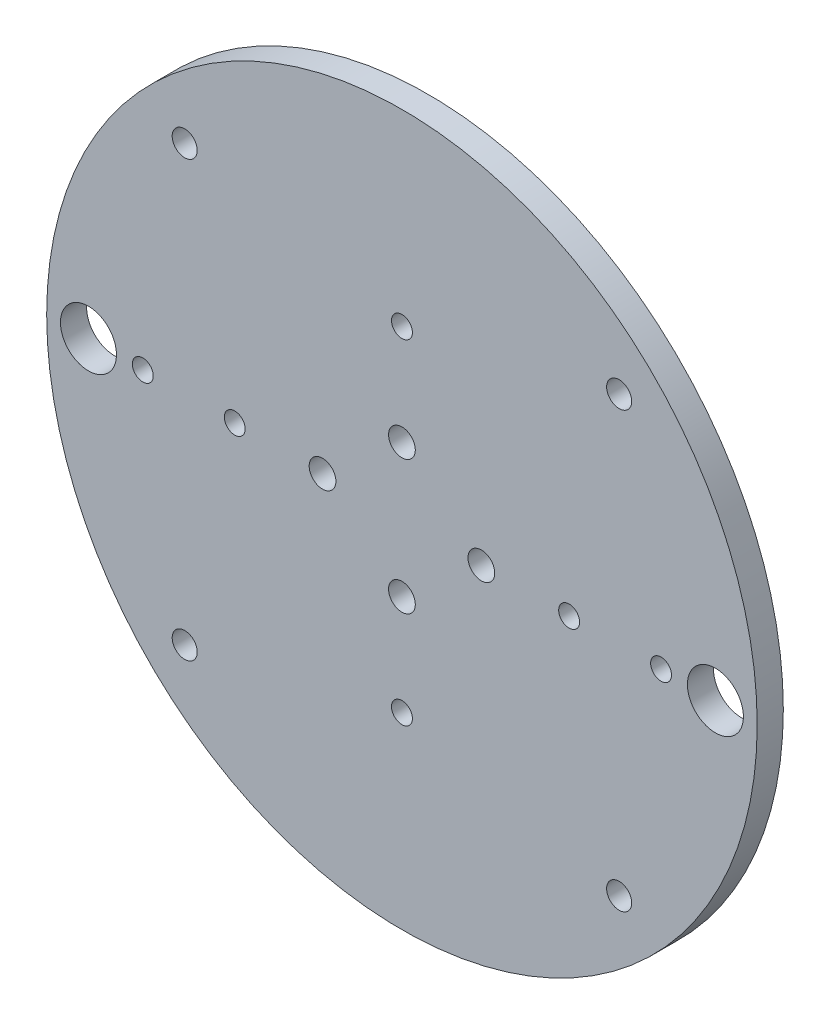
ISO-10303-21;
HEADER;
FILE_DESCRIPTION(('STEP AP214'),'2;1');
FILE_NAME('part.step','',(''),(''),'','','');
FILE_SCHEMA(('AUTOMOTIVE_DESIGN { 1 0 10303 214 1 1 1 1 }'));
ENDSEC;
DATA;
#1=APPLICATION_CONTEXT('core data for automotive mechanical design processes');
#2=APPLICATION_PROTOCOL_DEFINITION('international standard','automotive_design',2000,#1);
#3=PRODUCT_CONTEXT('',#1,'mechanical');
#4=PRODUCT('Part','Part','',(#3));
#5=PRODUCT_RELATED_PRODUCT_CATEGORY('part','',(#4));
#6=PRODUCT_DEFINITION_FORMATION('','',#4);
#7=PRODUCT_DEFINITION_CONTEXT('part definition',#1,'design');
#8=PRODUCT_DEFINITION('design','',#6,#7);
#9=PRODUCT_DEFINITION_SHAPE('','',#8);
#10=(LENGTH_UNIT() NAMED_UNIT(*) SI_UNIT(.MILLI.,.METRE.));
#11=(NAMED_UNIT(*) PLANE_ANGLE_UNIT() SI_UNIT($,.RADIAN.));
#12=(NAMED_UNIT(*) SI_UNIT($,.STERADIAN.) SOLID_ANGLE_UNIT());
#13=UNCERTAINTY_MEASURE_WITH_UNIT(LENGTH_MEASURE(1.E-05),#10,'distance_accuracy_value','');
#14=(GEOMETRIC_REPRESENTATION_CONTEXT(3) GLOBAL_UNCERTAINTY_ASSIGNED_CONTEXT((#13)) GLOBAL_UNIT_ASSIGNED_CONTEXT((#10,
#11,#12)) REPRESENTATION_CONTEXT('',''));
#15=CARTESIAN_POINT('',(0.,0.,0.));
#16=DIRECTION('',(0.,0.,1.));
#17=DIRECTION('',(1.,0.,0.));
#18=AXIS2_PLACEMENT_3D('',#15,#16,#17);
#19=CARTESIAN_POINT('',(0.,0.,-3.125));
#20=DIRECTION('',(0.,0.,1.));
#21=DIRECTION('',(-1.,0.,0.));
#22=AXIS2_PLACEMENT_3D('',#19,#20,#21);
#23=CYLINDRICAL_SURFACE('',#22,42.5);
#24=CARTESIAN_POINT('',(0.,0.,-3.125));
#25=DIRECTION('',(0.,0.,1.));
#26=DIRECTION('',(1.,0.,0.));
#27=AXIS2_PLACEMENT_3D('',#24,#25,#26);
#28=CIRCLE('',#27,42.5);
#29=CARTESIAN_POINT('',(42.5,0.,-3.125));
#30=VERTEX_POINT('',#29);
#31=EDGE_CURVE('E10',#30,#30,#28,.T.);
#32=ORIENTED_EDGE('',*,*,#31,.T.);
#33=EDGE_LOOP('',(#32));
#34=FACE_BOUND('',#33,.T.);
#35=CARTESIAN_POINT('',(0.,0.,0.));
#36=DIRECTION('',(0.,0.,1.));
#37=DIRECTION('',(1.,0.,0.));
#38=AXIS2_PLACEMENT_3D('',#35,#36,#37);
#39=CIRCLE('',#38,42.5);
#40=CARTESIAN_POINT('',(42.5,0.,0.));
#41=VERTEX_POINT('',#40);
#42=EDGE_CURVE('E44',#41,#41,#39,.T.);
#43=ORIENTED_EDGE('',*,*,#42,.F.);
#44=EDGE_LOOP('',(#43));
#45=FACE_BOUND('',#44,.T.);
#46=ADVANCED_FACE('F41',(#34,#45),#23,.T.);
#47=CARTESIAN_POINT('',(0.,0.,-3.125));
#48=DIRECTION('',(0.,0.,-1.));
#49=DIRECTION('',(1.,0.,0.));
#50=AXIS2_PLACEMENT_3D('',#47,#48,#49);
#51=PLANE('',#50);
#52=CARTESIAN_POINT('',(-37.5000000000009,7.14665452810843E-13,-3.125));
#53=DIRECTION('',(0.,0.,-1.));
#54=DIRECTION('',(-1.,0.,0.));
#55=AXIS2_PLACEMENT_3D('',#52,#53,#54);
#56=CIRCLE('',#55,3.34999999999896);
#57=CARTESIAN_POINT('',(-40.8499999999999,7.14665452810843E-13,-3.125));
#58=VERTEX_POINT('',#57);
#59=EDGE_CURVE('E105',#58,#58,#56,.T.);
#60=ORIENTED_EDGE('',*,*,#59,.F.);
#61=EDGE_LOOP('',(#60));
#62=FACE_BOUND('',#61,.T.);
#63=CARTESIAN_POINT('',(37.4999999999991,7.12465660988278E-13,-3.125));
#64=DIRECTION('',(0.,0.,-1.));
#65=DIRECTION('',(-1.,0.,0.));
#66=AXIS2_PLACEMENT_3D('',#63,#64,#65);
#67=CIRCLE('',#66,3.34999999999896);
#68=CARTESIAN_POINT('',(34.1500000000001,7.12465660988278E-13,-3.125));
#69=VERTEX_POINT('',#68);
#70=EDGE_CURVE('E137',#69,#69,#67,.T.);
#71=ORIENTED_EDGE('',*,*,#70,.F.);
#72=EDGE_LOOP('',(#71));
#73=FACE_BOUND('',#72,.T.);
#74=CARTESIAN_POINT('',(30.9999999999991,7.12465660988278E-13,-3.125));
#75=DIRECTION('',(0.,0.,-1.));
#76=DIRECTION('',(-1.,0.,0.));
#77=AXIS2_PLACEMENT_3D('',#74,#75,#76);
#78=CIRCLE('',#77,1.24999999999896);
#79=CARTESIAN_POINT('',(29.7500000000001,7.12465660988278E-13,-3.125));
#80=VERTEX_POINT('',#79);
#81=EDGE_CURVE('E131',#80,#80,#78,.T.);
#82=ORIENTED_EDGE('',*,*,#81,.F.);
#83=EDGE_LOOP('',(#82));
#84=FACE_BOUND('',#83,.T.);
#85=CARTESIAN_POINT('',(-31.0000000000009,7.14755658431594E-13,-3.125));
#86=DIRECTION('',(0.,0.,-1.));
#87=DIRECTION('',(-1.,0.,0.));
#88=AXIS2_PLACEMENT_3D('',#85,#86,#87);
#89=CIRCLE('',#88,1.24999999999896);
#90=CARTESIAN_POINT('',(-32.2499999999999,7.14755658431594E-13,-3.125));
#91=VERTEX_POINT('',#90);
#92=EDGE_CURVE('E125',#91,#91,#89,.T.);
#93=ORIENTED_EDGE('',*,*,#92,.F.);
#94=EDGE_LOOP('',(#93));
#95=FACE_BOUND('',#94,.T.);
#96=CARTESIAN_POINT('',(-9.5,0.,-3.125));
#97=DIRECTION('',(0.,0.,1.));
#98=DIRECTION('',(1.,0.,0.));
#99=AXIS2_PLACEMENT_3D('',#96,#97,#98);
#100=CIRCLE('',#99,1.6);
#101=CARTESIAN_POINT('',(-7.9,0.,-3.125));
#102=VERTEX_POINT('',#101);
#103=EDGE_CURVE('E120',#102,#102,#100,.T.);
#104=ORIENTED_EDGE('',*,*,#103,.T.);
#105=EDGE_LOOP('',(#104));
#106=FACE_BOUND('',#105,.T.);
#107=CARTESIAN_POINT('',(0.,8.,-3.125));
#108=DIRECTION('',(0.,0.,1.));
#109=DIRECTION('',(1.,0.,0.));
#110=AXIS2_PLACEMENT_3D('',#107,#108,#109);
#111=CIRCLE('',#110,1.6);
#112=CARTESIAN_POINT('',(1.6,8.,-3.125));
#113=VERTEX_POINT('',#112);
#114=EDGE_CURVE('E117',#113,#113,#111,.T.);
#115=ORIENTED_EDGE('',*,*,#114,.T.);
#116=EDGE_LOOP('',(#115));
#117=FACE_BOUND('',#116,.T.);
#118=CARTESIAN_POINT('',(9.5,0.,-3.125));
#119=DIRECTION('',(0.,0.,1.));
#120=DIRECTION('',(1.,0.,0.));
#121=AXIS2_PLACEMENT_3D('',#118,#119,#120);
#122=CIRCLE('',#121,1.6);
#123=CARTESIAN_POINT('',(11.1,0.,-3.125));
#124=VERTEX_POINT('',#123);
#125=EDGE_CURVE('E111',#124,#124,#122,.T.);
#126=ORIENTED_EDGE('',*,*,#125,.T.);
#127=EDGE_LOOP('',(#126));
#128=FACE_BOUND('',#127,.T.);
#129=CARTESIAN_POINT('',(0.,-8.00000000000001,-3.125));
#130=DIRECTION('',(0.,0.,1.));
#131=DIRECTION('',(1.,0.,0.));
#132=AXIS2_PLACEMENT_3D('',#129,#130,#131);
#133=CIRCLE('',#132,1.6);
#134=CARTESIAN_POINT('',(1.6,-8.00000000000001,-3.125));
#135=VERTEX_POINT('',#134);
#136=EDGE_CURVE('E104',#135,#135,#133,.T.);
#137=ORIENTED_EDGE('',*,*,#136,.T.);
#138=EDGE_LOOP('',(#137));
#139=FACE_BOUND('',#138,.T.);
#140=CARTESIAN_POINT('',(0.,20.,-3.125));
#141=DIRECTION('',(0.,0.,1.));
#142=DIRECTION('',(1.,0.,0.));
#143=AXIS2_PLACEMENT_3D('',#140,#141,#142);
#144=CIRCLE('',#143,1.25);
#145=CARTESIAN_POINT('',(1.25,20.,-3.125));
#146=VERTEX_POINT('',#145);
#147=EDGE_CURVE('E96',#146,#146,#144,.T.);
#148=ORIENTED_EDGE('',*,*,#147,.T.);
#149=EDGE_LOOP('',(#148));
#150=FACE_BOUND('',#149,.T.);
#151=CARTESIAN_POINT('',(20.,0.,-3.125));
#152=DIRECTION('',(0.,0.,1.));
#153=DIRECTION('',(1.,0.,0.));
#154=AXIS2_PLACEMENT_3D('',#151,#152,#153);
#155=CIRCLE('',#154,1.25);
#156=CARTESIAN_POINT('',(21.25,0.,-3.125));
#157=VERTEX_POINT('',#156);
#158=EDGE_CURVE('E93',#157,#157,#155,.T.);
#159=ORIENTED_EDGE('',*,*,#158,.T.);
#160=EDGE_LOOP('',(#159));
#161=FACE_BOUND('',#160,.T.);
#162=CARTESIAN_POINT('',(0.,-20.,-3.125));
#163=DIRECTION('',(0.,0.,1.));
#164=DIRECTION('',(1.,0.,0.));
#165=AXIS2_PLACEMENT_3D('',#162,#163,#164);
#166=CIRCLE('',#165,1.25);
#167=CARTESIAN_POINT('',(1.25,-20.,-3.125));
#168=VERTEX_POINT('',#167);
#169=EDGE_CURVE('E87',#168,#168,#166,.T.);
#170=ORIENTED_EDGE('',*,*,#169,.T.);
#171=EDGE_LOOP('',(#170));
#172=FACE_BOUND('',#171,.T.);
#173=CARTESIAN_POINT('',(-20.,0.,-3.125));
#174=DIRECTION('',(0.,0.,1.));
#175=DIRECTION('',(1.,0.,0.));
#176=AXIS2_PLACEMENT_3D('',#173,#174,#175);
#177=CIRCLE('',#176,1.25);
#178=CARTESIAN_POINT('',(-18.75,0.,-3.125));
#179=VERTEX_POINT('',#178);
#180=EDGE_CURVE('E80',#179,#179,#177,.T.);
#181=ORIENTED_EDGE('',*,*,#180,.T.);
#182=EDGE_LOOP('',(#181));
#183=FACE_BOUND('',#182,.T.);
#184=CARTESIAN_POINT('',(25.9861742086056,-25.9861742086057,-3.125));
#185=DIRECTION('',(0.,0.,-1.));
#186=DIRECTION('',(-1.,0.,0.));
#187=AXIS2_PLACEMENT_3D('',#184,#185,#186);
#188=CIRCLE('',#187,1.5);
#189=CARTESIAN_POINT('',(24.4861742086056,-25.9861742086057,-3.125));
#190=VERTEX_POINT('',#189);
#191=EDGE_CURVE('E66',#190,#190,#188,.T.);
#192=ORIENTED_EDGE('',*,*,#191,.F.);
#193=EDGE_LOOP('',(#192));
#194=FACE_BOUND('',#193,.T.);
#195=CARTESIAN_POINT('',(-25.9861742086055,25.9861742086057,-3.125));
#196=DIRECTION('',(0.,0.,-1.));
#197=DIRECTION('',(-1.,0.,0.));
#198=AXIS2_PLACEMENT_3D('',#195,#196,#197);
#199=CIRCLE('',#198,1.5);
#200=CARTESIAN_POINT('',(-27.4861742086055,25.9861742086057,-3.125));
#201=VERTEX_POINT('',#200);
#202=EDGE_CURVE('E59',#201,#201,#199,.T.);
#203=ORIENTED_EDGE('',*,*,#202,.F.);
#204=EDGE_LOOP('',(#203));
#205=FACE_BOUND('',#204,.T.);
#206=CARTESIAN_POINT('',(25.9861742086057,25.9861742086056,-3.125));
#207=DIRECTION('',(0.,0.,-1.));
#208=DIRECTION('',(-1.,0.,0.));
#209=AXIS2_PLACEMENT_3D('',#206,#207,#208);
#210=CIRCLE('',#209,1.5);
#211=CARTESIAN_POINT('',(24.4861742086057,25.9861742086056,-3.125));
#212=VERTEX_POINT('',#211);
#213=EDGE_CURVE('E71',#212,#212,#210,.T.);
#214=ORIENTED_EDGE('',*,*,#213,.F.);
#215=EDGE_LOOP('',(#214));
#216=FACE_BOUND('',#215,.T.);
#217=CARTESIAN_POINT('',(-25.9861742086056,-25.9861742086056,-3.125));
#218=DIRECTION('',(0.,0.,-1.));
#219=DIRECTION('',(-1.,0.,0.));
#220=AXIS2_PLACEMENT_3D('',#217,#218,#219);
#221=CIRCLE('',#220,1.5);
#222=CARTESIAN_POINT('',(-27.4861742086056,-25.9861742086056,-3.125));
#223=VERTEX_POINT('',#222);
#224=EDGE_CURVE('E51',#223,#223,#221,.T.);
#225=ORIENTED_EDGE('',*,*,#224,.F.);
#226=EDGE_LOOP('',(#225));
#227=FACE_BOUND('',#226,.T.);
#228=ORIENTED_EDGE('',*,*,#31,.F.);
#229=EDGE_LOOP('',(#228));
#230=FACE_BOUND('',#229,.T.);
#231=ADVANCED_FACE('F152',(#62,#73,#84,#95,#106,#117,#128,#139,#150,#161,#172,#183,#194,#205,
#216,#227,#230),#51,.T.);
#232=CARTESIAN_POINT('',(0.,0.,0.));
#233=DIRECTION('',(0.,0.,-1.));
#234=DIRECTION('',(1.,0.,0.));
#235=AXIS2_PLACEMENT_3D('',#232,#233,#234);
#236=PLANE('',#235);
#237=CARTESIAN_POINT('',(-37.5000000000009,7.14665452810843E-13,0.));
#238=DIRECTION('',(0.,0.,-1.));
#239=DIRECTION('',(-1.,0.,0.));
#240=AXIS2_PLACEMENT_3D('',#237,#238,#239);
#241=CIRCLE('',#240,3.34999999999896);
#242=CARTESIAN_POINT('',(-40.8499999999999,7.14665452810843E-13,0.));
#243=VERTEX_POINT('',#242);
#244=EDGE_CURVE('E143',#243,#243,#241,.T.);
#245=ORIENTED_EDGE('',*,*,#244,.T.);
#246=EDGE_LOOP('',(#245));
#247=FACE_BOUND('',#246,.T.);
#248=CARTESIAN_POINT('',(37.4999999999991,7.12465660988278E-13,0.));
#249=DIRECTION('',(0.,0.,-1.));
#250=DIRECTION('',(-1.,0.,0.));
#251=AXIS2_PLACEMENT_3D('',#248,#249,#250);
#252=CIRCLE('',#251,3.34999999999896);
#253=CARTESIAN_POINT('',(34.1500000000001,7.12465660988278E-13,0.));
#254=VERTEX_POINT('',#253);
#255=EDGE_CURVE('E140',#254,#254,#252,.T.);
#256=ORIENTED_EDGE('',*,*,#255,.T.);
#257=EDGE_LOOP('',(#256));
#258=FACE_BOUND('',#257,.T.);
#259=CARTESIAN_POINT('',(30.9999999999991,7.12465660988278E-13,0.));
#260=DIRECTION('',(0.,0.,-1.));
#261=DIRECTION('',(-1.,0.,0.));
#262=AXIS2_PLACEMENT_3D('',#259,#260,#261);
#263=CIRCLE('',#262,1.24999999999896);
#264=CARTESIAN_POINT('',(29.7500000000001,7.12465660988278E-13,0.));
#265=VERTEX_POINT('',#264);
#266=EDGE_CURVE('E134',#265,#265,#263,.T.);
#267=ORIENTED_EDGE('',*,*,#266,.T.);
#268=EDGE_LOOP('',(#267));
#269=FACE_BOUND('',#268,.T.);
#270=CARTESIAN_POINT('',(-31.0000000000009,7.14755658431594E-13,0.));
#271=DIRECTION('',(0.,0.,-1.));
#272=DIRECTION('',(-1.,0.,0.));
#273=AXIS2_PLACEMENT_3D('',#270,#271,#272);
#274=CIRCLE('',#273,1.24999999999896);
#275=CARTESIAN_POINT('',(-32.2499999999999,7.14755658431594E-13,0.));
#276=VERTEX_POINT('',#275);
#277=EDGE_CURVE('E128',#276,#276,#274,.T.);
#278=ORIENTED_EDGE('',*,*,#277,.T.);
#279=EDGE_LOOP('',(#278));
#280=FACE_BOUND('',#279,.T.);
#281=CARTESIAN_POINT('',(-9.5,0.,0.));
#282=DIRECTION('',(0.,0.,1.));
#283=DIRECTION('',(1.,0.,0.));
#284=AXIS2_PLACEMENT_3D('',#281,#282,#283);
#285=CIRCLE('',#284,1.6);
#286=CARTESIAN_POINT('',(-7.9,0.,0.));
#287=VERTEX_POINT('',#286);
#288=EDGE_CURVE('E81',#287,#287,#285,.T.);
#289=ORIENTED_EDGE('',*,*,#288,.F.);
#290=EDGE_LOOP('',(#289));
#291=FACE_BOUND('',#290,.T.);
#292=CARTESIAN_POINT('',(0.,8.,0.));
#293=DIRECTION('',(0.,0.,1.));
#294=DIRECTION('',(1.,0.,0.));
#295=AXIS2_PLACEMENT_3D('',#292,#293,#294);
#296=CIRCLE('',#295,1.6);
#297=CARTESIAN_POINT('',(1.6,8.,0.));
#298=VERTEX_POINT('',#297);
#299=EDGE_CURVE('E114',#298,#298,#296,.T.);
#300=ORIENTED_EDGE('',*,*,#299,.F.);
#301=EDGE_LOOP('',(#300));
#302=FACE_BOUND('',#301,.T.);
#303=CARTESIAN_POINT('',(9.5,0.,0.));
#304=DIRECTION('',(0.,0.,1.));
#305=DIRECTION('',(1.,0.,0.));
#306=AXIS2_PLACEMENT_3D('',#303,#304,#305);
#307=CIRCLE('',#306,1.6);
#308=CARTESIAN_POINT('',(11.1,0.,0.));
#309=VERTEX_POINT('',#308);
#310=EDGE_CURVE('E108',#309,#309,#307,.T.);
#311=ORIENTED_EDGE('',*,*,#310,.F.);
#312=EDGE_LOOP('',(#311));
#313=FACE_BOUND('',#312,.T.);
#314=CARTESIAN_POINT('',(0.,-8.00000000000001,0.));
#315=DIRECTION('',(0.,0.,1.));
#316=DIRECTION('',(1.,0.,0.));
#317=AXIS2_PLACEMENT_3D('',#314,#315,#316);
#318=CIRCLE('',#317,1.6);
#319=CARTESIAN_POINT('',(1.6,-8.00000000000001,0.));
#320=VERTEX_POINT('',#319);
#321=EDGE_CURVE('E101',#320,#320,#318,.T.);
#322=ORIENTED_EDGE('',*,*,#321,.F.);
#323=EDGE_LOOP('',(#322));
#324=FACE_BOUND('',#323,.T.);
#325=CARTESIAN_POINT('',(0.,20.,0.));
#326=DIRECTION('',(0.,0.,1.));
#327=DIRECTION('',(1.,0.,0.));
#328=AXIS2_PLACEMENT_3D('',#325,#326,#327);
#329=CIRCLE('',#328,1.25);
#330=CARTESIAN_POINT('',(1.25,20.,0.));
#331=VERTEX_POINT('',#330);
#332=EDGE_CURVE('E74',#331,#331,#329,.T.);
#333=ORIENTED_EDGE('',*,*,#332,.F.);
#334=EDGE_LOOP('',(#333));
#335=FACE_BOUND('',#334,.T.);
#336=CARTESIAN_POINT('',(20.,0.,0.));
#337=DIRECTION('',(0.,0.,1.));
#338=DIRECTION('',(1.,0.,0.));
#339=AXIS2_PLACEMENT_3D('',#336,#337,#338);
#340=CIRCLE('',#339,1.25);
#341=CARTESIAN_POINT('',(21.25,0.,0.));
#342=VERTEX_POINT('',#341);
#343=EDGE_CURVE('E90',#342,#342,#340,.T.);
#344=ORIENTED_EDGE('',*,*,#343,.F.);
#345=EDGE_LOOP('',(#344));
#346=FACE_BOUND('',#345,.T.);
#347=CARTESIAN_POINT('',(0.,-20.,0.));
#348=DIRECTION('',(0.,0.,1.));
#349=DIRECTION('',(1.,0.,0.));
#350=AXIS2_PLACEMENT_3D('',#347,#348,#349);
#351=CIRCLE('',#350,1.25);
#352=CARTESIAN_POINT('',(1.25,-20.,0.));
#353=VERTEX_POINT('',#352);
#354=EDGE_CURVE('E84',#353,#353,#351,.T.);
#355=ORIENTED_EDGE('',*,*,#354,.F.);
#356=EDGE_LOOP('',(#355));
#357=FACE_BOUND('',#356,.T.);
#358=CARTESIAN_POINT('',(-20.,0.,0.));
#359=DIRECTION('',(0.,0.,1.));
#360=DIRECTION('',(1.,0.,0.));
#361=AXIS2_PLACEMENT_3D('',#358,#359,#360);
#362=CIRCLE('',#361,1.25);
#363=CARTESIAN_POINT('',(-18.75,0.,0.));
#364=VERTEX_POINT('',#363);
#365=EDGE_CURVE('E77',#364,#364,#362,.T.);
#366=ORIENTED_EDGE('',*,*,#365,.F.);
#367=EDGE_LOOP('',(#366));
#368=FACE_BOUND('',#367,.T.);
#369=CARTESIAN_POINT('',(25.9861742086056,-25.9861742086057,0.));
#370=DIRECTION('',(0.,0.,-1.));
#371=DIRECTION('',(-1.,0.,0.));
#372=AXIS2_PLACEMENT_3D('',#369,#370,#371);
#373=CIRCLE('',#372,1.5);
#374=CARTESIAN_POINT('',(24.4861742086056,-25.9861742086057,0.));
#375=VERTEX_POINT('',#374);
#376=EDGE_CURVE('E56',#375,#375,#373,.T.);
#377=ORIENTED_EDGE('',*,*,#376,.T.);
#378=EDGE_LOOP('',(#377));
#379=FACE_BOUND('',#378,.T.);
#380=CARTESIAN_POINT('',(-25.9861742086055,25.9861742086057,0.));
#381=DIRECTION('',(0.,0.,-1.));
#382=DIRECTION('',(-1.,0.,0.));
#383=AXIS2_PLACEMENT_3D('',#380,#381,#382);
#384=CIRCLE('',#383,1.5);
#385=CARTESIAN_POINT('',(-27.4861742086055,25.9861742086057,0.));
#386=VERTEX_POINT('',#385);
#387=EDGE_CURVE('E62',#386,#386,#384,.T.);
#388=ORIENTED_EDGE('',*,*,#387,.T.);
#389=EDGE_LOOP('',(#388));
#390=FACE_BOUND('',#389,.T.);
#391=CARTESIAN_POINT('',(25.9861742086057,25.9861742086056,0.));
#392=DIRECTION('',(0.,0.,-1.));
#393=DIRECTION('',(-1.,0.,0.));
#394=AXIS2_PLACEMENT_3D('',#391,#392,#393);
#395=CIRCLE('',#394,1.5);
#396=CARTESIAN_POINT('',(24.4861742086057,25.9861742086056,0.));
#397=VERTEX_POINT('',#396);
#398=EDGE_CURVE('E63',#397,#397,#395,.T.);
#399=ORIENTED_EDGE('',*,*,#398,.T.);
#400=EDGE_LOOP('',(#399));
#401=FACE_BOUND('',#400,.T.);
#402=CARTESIAN_POINT('',(-25.9861742086056,-25.9861742086056,0.));
#403=DIRECTION('',(0.,0.,-1.));
#404=DIRECTION('',(-1.,0.,0.));
#405=AXIS2_PLACEMENT_3D('',#402,#403,#404);
#406=CIRCLE('',#405,1.5);
#407=CARTESIAN_POINT('',(-27.4861742086056,-25.9861742086056,0.));
#408=VERTEX_POINT('',#407);
#409=EDGE_CURVE('E53',#408,#408,#406,.T.);
#410=ORIENTED_EDGE('',*,*,#409,.T.);
#411=EDGE_LOOP('',(#410));
#412=FACE_BOUND('',#411,.T.);
#413=ORIENTED_EDGE('',*,*,#42,.T.);
#414=EDGE_LOOP('',(#413));
#415=FACE_BOUND('',#414,.T.);
#416=ADVANCED_FACE('F155',(#247,#258,#269,#280,#291,#302,#313,#324,#335,#346,#357,#368,#379,
#390,#401,#412,#415),#236,.F.);
#417=CARTESIAN_POINT('',(-25.9861742086056,-25.9861742086056,-3.125));
#418=DIRECTION('',(0.,0.,1.));
#419=DIRECTION('',(-1.,0.,0.));
#420=AXIS2_PLACEMENT_3D('',#417,#418,#419);
#421=CYLINDRICAL_SURFACE('',#420,1.5);
#422=ORIENTED_EDGE('',*,*,#224,.T.);
#423=EDGE_LOOP('',(#422));
#424=FACE_BOUND('',#423,.T.);
#425=ORIENTED_EDGE('',*,*,#409,.F.);
#426=EDGE_LOOP('',(#425));
#427=FACE_BOUND('',#426,.T.);
#428=ADVANCED_FACE('F188',(#424,#427),#421,.F.);
#429=CARTESIAN_POINT('',(25.9861742086057,25.9861742086056,-3.125));
#430=DIRECTION('',(0.,0.,1.));
#431=DIRECTION('',(-1.,0.,0.));
#432=AXIS2_PLACEMENT_3D('',#429,#430,#431);
#433=CYLINDRICAL_SURFACE('',#432,1.5);
#434=ORIENTED_EDGE('',*,*,#213,.T.);
#435=EDGE_LOOP('',(#434));
#436=FACE_BOUND('',#435,.T.);
#437=ORIENTED_EDGE('',*,*,#398,.F.);
#438=EDGE_LOOP('',(#437));
#439=FACE_BOUND('',#438,.T.);
#440=ADVANCED_FACE('F191',(#436,#439),#433,.F.);
#441=CARTESIAN_POINT('',(-25.9861742086055,25.9861742086057,-3.125));
#442=DIRECTION('',(0.,0.,1.));
#443=DIRECTION('',(-1.,0.,0.));
#444=AXIS2_PLACEMENT_3D('',#441,#442,#443);
#445=CYLINDRICAL_SURFACE('',#444,1.5);
#446=ORIENTED_EDGE('',*,*,#202,.T.);
#447=EDGE_LOOP('',(#446));
#448=FACE_BOUND('',#447,.T.);
#449=ORIENTED_EDGE('',*,*,#387,.F.);
#450=EDGE_LOOP('',(#449));
#451=FACE_BOUND('',#450,.T.);
#452=ADVANCED_FACE('F225',(#448,#451),#445,.F.);
#453=CARTESIAN_POINT('',(25.9861742086056,-25.9861742086057,-3.125));
#454=DIRECTION('',(0.,0.,1.));
#455=DIRECTION('',(-1.,0.,0.));
#456=AXIS2_PLACEMENT_3D('',#453,#454,#455);
#457=CYLINDRICAL_SURFACE('',#456,1.5);
#458=ORIENTED_EDGE('',*,*,#191,.T.);
#459=EDGE_LOOP('',(#458));
#460=FACE_BOUND('',#459,.T.);
#461=ORIENTED_EDGE('',*,*,#376,.F.);
#462=EDGE_LOOP('',(#461));
#463=FACE_BOUND('',#462,.T.);
#464=ADVANCED_FACE('F234',(#460,#463),#457,.F.);
#465=CARTESIAN_POINT('',(-20.,0.,0.));
#466=DIRECTION('',(0.,0.,-1.));
#467=DIRECTION('',(1.,0.,0.));
#468=AXIS2_PLACEMENT_3D('',#465,#466,#467);
#469=CYLINDRICAL_SURFACE('',#468,1.25);
#470=ORIENTED_EDGE('',*,*,#365,.T.);
#471=EDGE_LOOP('',(#470));
#472=FACE_BOUND('',#471,.T.);
#473=ORIENTED_EDGE('',*,*,#180,.F.);
#474=EDGE_LOOP('',(#473));
#475=FACE_BOUND('',#474,.T.);
#476=ADVANCED_FACE('F243',(#472,#475),#469,.F.);
#477=CARTESIAN_POINT('',(0.,-20.,0.));
#478=DIRECTION('',(0.,0.,-1.));
#479=DIRECTION('',(1.,0.,0.));
#480=AXIS2_PLACEMENT_3D('',#477,#478,#479);
#481=CYLINDRICAL_SURFACE('',#480,1.25);
#482=ORIENTED_EDGE('',*,*,#354,.T.);
#483=EDGE_LOOP('',(#482));
#484=FACE_BOUND('',#483,.T.);
#485=ORIENTED_EDGE('',*,*,#169,.F.);
#486=EDGE_LOOP('',(#485));
#487=FACE_BOUND('',#486,.T.);
#488=ADVANCED_FACE('F252',(#484,#487),#481,.F.);
#489=CARTESIAN_POINT('',(20.,0.,0.));
#490=DIRECTION('',(0.,0.,-1.));
#491=DIRECTION('',(1.,0.,0.));
#492=AXIS2_PLACEMENT_3D('',#489,#490,#491);
#493=CYLINDRICAL_SURFACE('',#492,1.25);
#494=ORIENTED_EDGE('',*,*,#343,.T.);
#495=EDGE_LOOP('',(#494));
#496=FACE_BOUND('',#495,.T.);
#497=ORIENTED_EDGE('',*,*,#158,.F.);
#498=EDGE_LOOP('',(#497));
#499=FACE_BOUND('',#498,.T.);
#500=ADVANCED_FACE('F261',(#496,#499),#493,.F.);
#501=CARTESIAN_POINT('',(0.,20.,0.));
#502=DIRECTION('',(0.,0.,-1.));
#503=DIRECTION('',(1.,0.,0.));
#504=AXIS2_PLACEMENT_3D('',#501,#502,#503);
#505=CYLINDRICAL_SURFACE('',#504,1.25);
#506=ORIENTED_EDGE('',*,*,#332,.T.);
#507=EDGE_LOOP('',(#506));
#508=FACE_BOUND('',#507,.T.);
#509=ORIENTED_EDGE('',*,*,#147,.F.);
#510=EDGE_LOOP('',(#509));
#511=FACE_BOUND('',#510,.T.);
#512=ADVANCED_FACE('F270',(#508,#511),#505,.F.);
#513=CARTESIAN_POINT('',(0.,-8.00000000000001,0.));
#514=DIRECTION('',(0.,0.,-1.));
#515=DIRECTION('',(1.,0.,0.));
#516=AXIS2_PLACEMENT_3D('',#513,#514,#515);
#517=CYLINDRICAL_SURFACE('',#516,1.6);
#518=ORIENTED_EDGE('',*,*,#321,.T.);
#519=EDGE_LOOP('',(#518));
#520=FACE_BOUND('',#519,.T.);
#521=ORIENTED_EDGE('',*,*,#136,.F.);
#522=EDGE_LOOP('',(#521));
#523=FACE_BOUND('',#522,.T.);
#524=ADVANCED_FACE('F279',(#520,#523),#517,.F.);
#525=CARTESIAN_POINT('',(9.5,0.,0.));
#526=DIRECTION('',(0.,0.,-1.));
#527=DIRECTION('',(1.,0.,0.));
#528=AXIS2_PLACEMENT_3D('',#525,#526,#527);
#529=CYLINDRICAL_SURFACE('',#528,1.6);
#530=ORIENTED_EDGE('',*,*,#310,.T.);
#531=EDGE_LOOP('',(#530));
#532=FACE_BOUND('',#531,.T.);
#533=ORIENTED_EDGE('',*,*,#125,.F.);
#534=EDGE_LOOP('',(#533));
#535=FACE_BOUND('',#534,.T.);
#536=ADVANCED_FACE('F288',(#532,#535),#529,.F.);
#537=CARTESIAN_POINT('',(0.,8.,0.));
#538=DIRECTION('',(0.,0.,-1.));
#539=DIRECTION('',(1.,0.,0.));
#540=AXIS2_PLACEMENT_3D('',#537,#538,#539);
#541=CYLINDRICAL_SURFACE('',#540,1.6);
#542=ORIENTED_EDGE('',*,*,#299,.T.);
#543=EDGE_LOOP('',(#542));
#544=FACE_BOUND('',#543,.T.);
#545=ORIENTED_EDGE('',*,*,#114,.F.);
#546=EDGE_LOOP('',(#545));
#547=FACE_BOUND('',#546,.T.);
#548=ADVANCED_FACE('F297',(#544,#547),#541,.F.);
#549=CARTESIAN_POINT('',(-9.5,0.,0.));
#550=DIRECTION('',(0.,0.,-1.));
#551=DIRECTION('',(1.,0.,0.));
#552=AXIS2_PLACEMENT_3D('',#549,#550,#551);
#553=CYLINDRICAL_SURFACE('',#552,1.6);
#554=ORIENTED_EDGE('',*,*,#288,.T.);
#555=EDGE_LOOP('',(#554));
#556=FACE_BOUND('',#555,.T.);
#557=ORIENTED_EDGE('',*,*,#103,.F.);
#558=EDGE_LOOP('',(#557));
#559=FACE_BOUND('',#558,.T.);
#560=ADVANCED_FACE('F306',(#556,#559),#553,.F.);
#561=CARTESIAN_POINT('',(-31.0000000000009,7.14755658431594E-13,-3.125));
#562=DIRECTION('',(0.,0.,1.));
#563=DIRECTION('',(-1.,0.,0.));
#564=AXIS2_PLACEMENT_3D('',#561,#562,#563);
#565=CYLINDRICAL_SURFACE('',#564,1.24999999999896);
#566=ORIENTED_EDGE('',*,*,#92,.T.);
#567=EDGE_LOOP('',(#566));
#568=FACE_BOUND('',#567,.T.);
#569=ORIENTED_EDGE('',*,*,#277,.F.);
#570=EDGE_LOOP('',(#569));
#571=FACE_BOUND('',#570,.T.);
#572=ADVANCED_FACE('F315',(#568,#571),#565,.F.);
#573=CARTESIAN_POINT('',(30.9999999999991,7.12465660988278E-13,-3.125));
#574=DIRECTION('',(0.,0.,1.));
#575=DIRECTION('',(-1.,0.,0.));
#576=AXIS2_PLACEMENT_3D('',#573,#574,#575);
#577=CYLINDRICAL_SURFACE('',#576,1.24999999999896);
#578=ORIENTED_EDGE('',*,*,#81,.T.);
#579=EDGE_LOOP('',(#578));
#580=FACE_BOUND('',#579,.T.);
#581=ORIENTED_EDGE('',*,*,#266,.F.);
#582=EDGE_LOOP('',(#581));
#583=FACE_BOUND('',#582,.T.);
#584=ADVANCED_FACE('F324',(#580,#583),#577,.F.);
#585=CARTESIAN_POINT('',(37.4999999999991,7.12465660988278E-13,-3.125));
#586=DIRECTION('',(0.,0.,1.));
#587=DIRECTION('',(-1.,0.,0.));
#588=AXIS2_PLACEMENT_3D('',#585,#586,#587);
#589=CYLINDRICAL_SURFACE('',#588,3.34999999999896);
#590=ORIENTED_EDGE('',*,*,#70,.T.);
#591=EDGE_LOOP('',(#590));
#592=FACE_BOUND('',#591,.T.);
#593=ORIENTED_EDGE('',*,*,#255,.F.);
#594=EDGE_LOOP('',(#593));
#595=FACE_BOUND('',#594,.T.);
#596=ADVANCED_FACE('F333',(#592,#595),#589,.F.);
#597=CARTESIAN_POINT('',(-37.5000000000009,7.14665452810843E-13,-3.125));
#598=DIRECTION('',(0.,0.,1.));
#599=DIRECTION('',(-1.,0.,0.));
#600=AXIS2_PLACEMENT_3D('',#597,#598,#599);
#601=CYLINDRICAL_SURFACE('',#600,3.34999999999896);
#602=ORIENTED_EDGE('',*,*,#59,.T.);
#603=EDGE_LOOP('',(#602));
#604=FACE_BOUND('',#603,.T.);
#605=ORIENTED_EDGE('',*,*,#244,.F.);
#606=EDGE_LOOP('',(#605));
#607=FACE_BOUND('',#606,.T.);
#608=ADVANCED_FACE('F149',(#604,#607),#601,.F.);
#609=CLOSED_SHELL('',(#46,#231,#416,#428,#440,#452,#464,#476,#488,#500,#512,#524,#536,#548,#560,
#572,#584,#596,#608));
#610=MANIFOLD_SOLID_BREP('B2',#609);
#611=ADVANCED_BREP_SHAPE_REPRESENTATION('',(#18,#610),#14);
#612=SHAPE_DEFINITION_REPRESENTATION(#9,#611);
ENDSEC;
END-ISO-10303-21;
